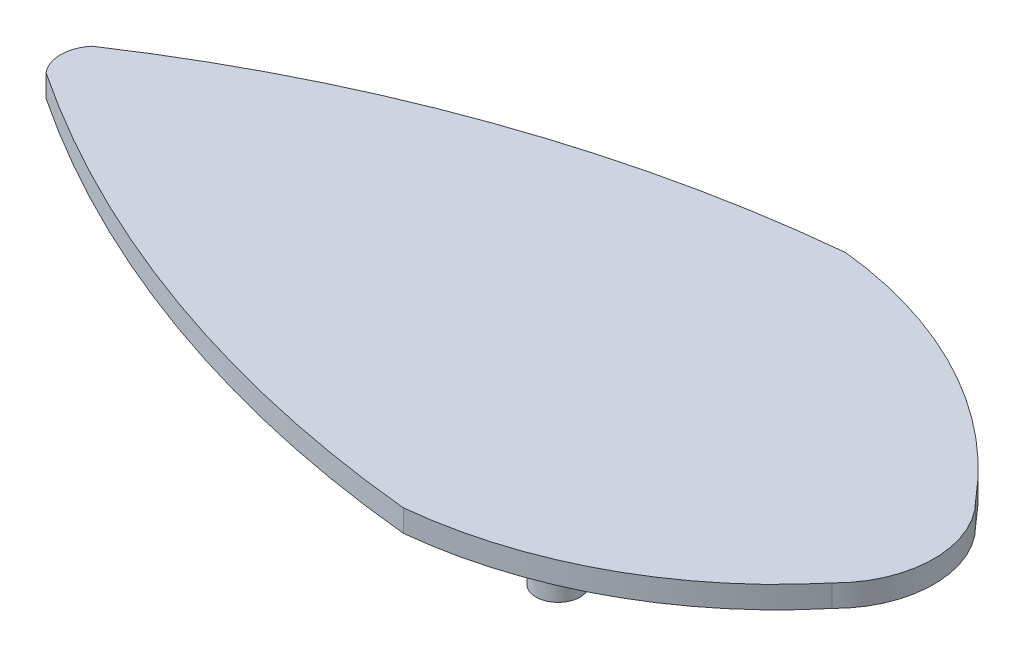
ISO-10303-21;
HEADER;
FILE_DESCRIPTION(('STEP AP214'),'2;1');
FILE_NAME('part.step','',(''),(''),'','','');
FILE_SCHEMA(('AUTOMOTIVE_DESIGN { 1 0 10303 214 1 1 1 1 }'));
ENDSEC;
DATA;
#1=APPLICATION_CONTEXT('core data for automotive mechanical design processes');
#2=APPLICATION_PROTOCOL_DEFINITION('international standard','automotive_design',2000,#1);
#3=PRODUCT_CONTEXT('',#1,'mechanical');
#4=PRODUCT('Part','Part','',(#3));
#5=PRODUCT_RELATED_PRODUCT_CATEGORY('part','',(#4));
#6=PRODUCT_DEFINITION_FORMATION('','',#4);
#7=PRODUCT_DEFINITION_CONTEXT('part definition',#1,'design');
#8=PRODUCT_DEFINITION('design','',#6,#7);
#9=PRODUCT_DEFINITION_SHAPE('','',#8);
#10=(LENGTH_UNIT() NAMED_UNIT(*) SI_UNIT(.MILLI.,.METRE.));
#11=(NAMED_UNIT(*) PLANE_ANGLE_UNIT() SI_UNIT($,.RADIAN.));
#12=(NAMED_UNIT(*) SI_UNIT($,.STERADIAN.) SOLID_ANGLE_UNIT());
#13=UNCERTAINTY_MEASURE_WITH_UNIT(LENGTH_MEASURE(1.E-05),#10,'distance_accuracy_value','');
#14=(GEOMETRIC_REPRESENTATION_CONTEXT(3) GLOBAL_UNCERTAINTY_ASSIGNED_CONTEXT((#13)) GLOBAL_UNIT_ASSIGNED_CONTEXT((#10,
#11,#12)) REPRESENTATION_CONTEXT('',''));
#15=CARTESIAN_POINT('',(0.,0.,0.));
#16=DIRECTION('',(0.,0.,1.));
#17=DIRECTION('',(1.,0.,0.));
#18=AXIS2_PLACEMENT_3D('',#15,#16,#17);
#19=CARTESIAN_POINT('',(-12.4327302607513,6.35,-56.3469062361884));
#20=DIRECTION('',(0.,-1.,0.));
#21=DIRECTION('',(0.,0.,-1.));
#22=AXIS2_PLACEMENT_3D('',#19,#20,#21);
#23=CYLINDRICAL_SURFACE('',#22,120.490056503109);
#24=CARTESIAN_POINT('',(-12.4327302607513,0.,-56.3469062361884));
#25=DIRECTION('',(0.,1.,0.));
#26=DIRECTION('',(0.,0.,1.));
#27=AXIS2_PLACEMENT_3D('',#24,#25,#26);
#28=CIRCLE('',#27,120.490056503109);
#29=CARTESIAN_POINT('',(0.,0.,63.5));
#30=VERTEX_POINT('',#29);
#31=CARTESIAN_POINT('',(80.2701382509386,0.,20.6208265212903));
#32=VERTEX_POINT('',#31);
#33=EDGE_CURVE('E118',#30,#32,#28,.T.);
#34=ORIENTED_EDGE('',*,*,#33,.T.);
#35=DIRECTION('',(0.,-1.,0.));
#36=VECTOR('',#35,1.);
#37=CARTESIAN_POINT('',(80.2701382509386,6.35,20.6208265212903));
#38=LINE('',#37,#36);
#39=CARTESIAN_POINT('',(80.2701382509386,6.35,20.6208265212903));
#40=VERTEX_POINT('',#39);
#41=EDGE_CURVE('E11',#40,#32,#38,.T.);
#42=ORIENTED_EDGE('',*,*,#41,.F.);
#43=CARTESIAN_POINT('',(-12.4327302607513,6.35,-56.3469062361884));
#44=DIRECTION('',(0.,1.,0.));
#45=DIRECTION('',(0.,0.,1.));
#46=AXIS2_PLACEMENT_3D('',#43,#44,#45);
#47=CIRCLE('',#46,120.490056503109);
#48=CARTESIAN_POINT('',(0.,6.35,63.5));
#49=VERTEX_POINT('',#48);
#50=EDGE_CURVE('E129',#49,#40,#47,.T.);
#51=ORIENTED_EDGE('',*,*,#50,.F.);
#52=DIRECTION('',(0.,-1.,0.));
#53=VECTOR('',#52,1.);
#54=CARTESIAN_POINT('',(0.,6.35,63.5));
#55=LINE('',#54,#53);
#56=EDGE_CURVE('E114',#49,#30,#55,.T.);
#57=ORIENTED_EDGE('',*,*,#56,.T.);
#58=EDGE_LOOP('',(#34,#42,#51,#57));
#59=FACE_BOUND('',#58,.T.);
#60=ADVANCED_FACE('F34',(#59),#23,.T.);
#61=CARTESIAN_POINT('',(59.9486091921802,6.35,0.));
#62=DIRECTION('',(0.,-1.,0.));
#63=DIRECTION('',(0.,0.,-1.));
#64=AXIS2_PLACEMENT_3D('',#61,#62,#63);
#65=CYLINDRICAL_SURFACE('',#64,28.9513908078198);
#66=CARTESIAN_POINT('',(59.9486091921802,0.,0.));
#67=DIRECTION('',(0.,1.,0.));
#68=DIRECTION('',(0.,0.,-1.));
#69=AXIS2_PLACEMENT_3D('',#66,#67,#68);
#70=CIRCLE('',#69,28.9513908078198);
#71=CARTESIAN_POINT('',(80.2701382509386,0.,-20.6208265212903));
#72=VERTEX_POINT('',#71);
#73=EDGE_CURVE('E121',#32,#72,#70,.T.);
#74=ORIENTED_EDGE('',*,*,#73,.T.);
#75=DIRECTION('',(0.,-1.,0.));
#76=VECTOR('',#75,1.);
#77=CARTESIAN_POINT('',(80.2701382509386,6.35,-20.6208265212903));
#78=LINE('',#77,#76);
#79=CARTESIAN_POINT('',(80.2701382509386,6.35,-20.6208265212903));
#80=VERTEX_POINT('',#79);
#81=EDGE_CURVE('E42',#80,#72,#78,.T.);
#82=ORIENTED_EDGE('',*,*,#81,.F.);
#83=CARTESIAN_POINT('',(59.9486091921802,6.35,0.));
#84=DIRECTION('',(0.,1.,0.));
#85=DIRECTION('',(0.,0.,-1.));
#86=AXIS2_PLACEMENT_3D('',#83,#84,#85);
#87=CIRCLE('',#86,28.9513908078198);
#88=EDGE_CURVE('E87',#40,#80,#87,.T.);
#89=ORIENTED_EDGE('',*,*,#88,.F.);
#90=ORIENTED_EDGE('',*,*,#41,.T.);
#91=EDGE_LOOP('',(#74,#82,#89,#90));
#92=FACE_BOUND('',#91,.T.);
#93=ADVANCED_FACE('F153',(#92),#65,.T.);
#94=CARTESIAN_POINT('',(-12.4327302607513,6.35,56.3469062361884));
#95=DIRECTION('',(0.,-1.,0.));
#96=DIRECTION('',(0.,0.,-1.));
#97=AXIS2_PLACEMENT_3D('',#94,#95,#96);
#98=CYLINDRICAL_SURFACE('',#97,120.490056503109);
#99=CARTESIAN_POINT('',(-12.4327302607513,0.,56.3469062361884));
#100=DIRECTION('',(0.,1.,0.));
#101=DIRECTION('',(0.,0.,-1.));
#102=AXIS2_PLACEMENT_3D('',#99,#100,#101);
#103=CIRCLE('',#102,120.490056503109);
#104=CARTESIAN_POINT('',(0.,0.,-63.4999999999999));
#105=VERTEX_POINT('',#104);
#106=EDGE_CURVE('E124',#72,#105,#103,.T.);
#107=ORIENTED_EDGE('',*,*,#106,.T.);
#108=DIRECTION('',(0.,-1.,0.));
#109=VECTOR('',#108,1.);
#110=CARTESIAN_POINT('',(0.,6.35,-63.4999999999999));
#111=LINE('',#110,#109);
#112=CARTESIAN_POINT('',(0.,6.35,-63.4999999999999));
#113=VERTEX_POINT('',#112);
#114=EDGE_CURVE('E109',#113,#105,#111,.T.);
#115=ORIENTED_EDGE('',*,*,#114,.F.);
#116=CARTESIAN_POINT('',(-12.4327302607513,6.35,56.3469062361884));
#117=DIRECTION('',(0.,1.,0.));
#118=DIRECTION('',(0.,0.,-1.));
#119=AXIS2_PLACEMENT_3D('',#116,#117,#118);
#120=CIRCLE('',#119,120.490056503109);
#121=EDGE_CURVE('E100',#80,#113,#120,.T.);
#122=ORIENTED_EDGE('',*,*,#121,.F.);
#123=ORIENTED_EDGE('',*,*,#81,.T.);
#124=EDGE_LOOP('',(#107,#115,#122,#123));
#125=FACE_BOUND('',#124,.T.);
#126=ADVANCED_FACE('F135',(#125),#98,.T.);
#127=CARTESIAN_POINT('',(34.1453229325715,6.35,284.349191046045));
#128=DIRECTION('',(0.,-1.,0.));
#129=DIRECTION('',(0.,0.,-1.));
#130=AXIS2_PLACEMENT_3D('',#127,#128,#129);
#131=CYLINDRICAL_SURFACE('',#130,349.521047706082);
#132=CARTESIAN_POINT('',(34.1453229325715,0.,284.349191046045));
#133=DIRECTION('',(0.,1.,0.));
#134=DIRECTION('',(0.,0.,-1.));
#135=AXIS2_PLACEMENT_3D('',#132,#133,#134);
#136=CIRCLE('',#135,349.521047706082);
#137=CARTESIAN_POINT('',(-159.524805442001,0.,-6.60930112239821));
#138=VERTEX_POINT('',#137);
#139=EDGE_CURVE('E108',#105,#138,#136,.T.);
#140=ORIENTED_EDGE('',*,*,#139,.T.);
#141=DIRECTION('',(0.,-1.,0.));
#142=VECTOR('',#141,1.);
#143=CARTESIAN_POINT('',(-159.524805442001,6.35,-6.60930112239821));
#144=LINE('',#143,#142);
#145=CARTESIAN_POINT('',(-159.524805442001,6.35,-6.60930112239821));
#146=VERTEX_POINT('',#145);
#147=EDGE_CURVE('E105',#146,#138,#144,.T.);
#148=ORIENTED_EDGE('',*,*,#147,.F.);
#149=CARTESIAN_POINT('',(34.1453229325715,6.35,284.349191046045));
#150=DIRECTION('',(0.,1.,0.));
#151=DIRECTION('',(0.,0.,-1.));
#152=AXIS2_PLACEMENT_3D('',#149,#150,#151);
#153=CIRCLE('',#152,349.521047706082);
#154=EDGE_CURVE('E94',#113,#146,#153,.T.);
#155=ORIENTED_EDGE('',*,*,#154,.F.);
#156=ORIENTED_EDGE('',*,*,#114,.T.);
#157=EDGE_LOOP('',(#140,#148,#155,#156));
#158=FACE_BOUND('',#157,.T.);
#159=ADVANCED_FACE('F106',(#158),#131,.T.);
#160=CARTESIAN_POINT('',(-151.625044298908,6.35,0.));
#161=DIRECTION('',(0.,-1.,0.));
#162=DIRECTION('',(0.,0.,-1.));
#163=AXIS2_PLACEMENT_3D('',#160,#161,#162);
#164=CYLINDRICAL_SURFACE('',#163,10.299955701092);
#165=CARTESIAN_POINT('',(-151.625044298908,0.,0.));
#166=DIRECTION('',(0.,1.,0.));
#167=DIRECTION('',(0.,0.,1.));
#168=AXIS2_PLACEMENT_3D('',#165,#166,#167);
#169=CIRCLE('',#168,10.299955701092);
#170=CARTESIAN_POINT('',(-159.524805442001,0.,6.60930112239821));
#171=VERTEX_POINT('',#170);
#172=EDGE_CURVE('E73',#138,#171,#169,.T.);
#173=ORIENTED_EDGE('',*,*,#172,.T.);
#174=DIRECTION('',(0.,-1.,0.));
#175=VECTOR('',#174,1.);
#176=CARTESIAN_POINT('',(-159.524805442001,6.35,6.60930112239821));
#177=LINE('',#176,#175);
#178=CARTESIAN_POINT('',(-159.524805442001,6.35,6.60930112239821));
#179=VERTEX_POINT('',#178);
#180=EDGE_CURVE('E110',#179,#171,#177,.T.);
#181=ORIENTED_EDGE('',*,*,#180,.F.);
#182=CARTESIAN_POINT('',(-151.625044298908,6.35,0.));
#183=DIRECTION('',(0.,1.,0.));
#184=DIRECTION('',(0.,0.,1.));
#185=AXIS2_PLACEMENT_3D('',#182,#183,#184);
#186=CIRCLE('',#185,10.299955701092);
#187=EDGE_CURVE('E98',#146,#179,#186,.T.);
#188=ORIENTED_EDGE('',*,*,#187,.F.);
#189=ORIENTED_EDGE('',*,*,#147,.T.);
#190=EDGE_LOOP('',(#173,#181,#188,#189));
#191=FACE_BOUND('',#190,.T.);
#192=ADVANCED_FACE('F112',(#191),#164,.T.);
#193=CARTESIAN_POINT('',(34.1453229325715,6.35,-284.349191046045));
#194=DIRECTION('',(0.,-1.,0.));
#195=DIRECTION('',(0.,0.,-1.));
#196=AXIS2_PLACEMENT_3D('',#193,#194,#195);
#197=CYLINDRICAL_SURFACE('',#196,349.521047706082);
#198=CARTESIAN_POINT('',(34.1453229325715,0.,-284.349191046045));
#199=DIRECTION('',(0.,1.,0.));
#200=DIRECTION('',(0.,0.,1.));
#201=AXIS2_PLACEMENT_3D('',#198,#199,#200);
#202=CIRCLE('',#201,349.521047706082);
#203=EDGE_CURVE('E79',#171,#30,#202,.T.);
#204=ORIENTED_EDGE('',*,*,#203,.T.);
#205=ORIENTED_EDGE('',*,*,#56,.F.);
#206=CARTESIAN_POINT('',(34.1453229325715,6.35,-284.349191046045));
#207=DIRECTION('',(0.,1.,0.));
#208=DIRECTION('',(0.,0.,1.));
#209=AXIS2_PLACEMENT_3D('',#206,#207,#208);
#210=CIRCLE('',#209,349.521047706082);
#211=EDGE_CURVE('E50',#179,#49,#210,.T.);
#212=ORIENTED_EDGE('',*,*,#211,.F.);
#213=ORIENTED_EDGE('',*,*,#180,.T.);
#214=EDGE_LOOP('',(#204,#205,#212,#213));
#215=FACE_BOUND('',#214,.T.);
#216=ADVANCED_FACE('F142',(#215),#197,.T.);
#217=CARTESIAN_POINT('',(23.7579394657144,6.35,-28.1734531180942));
#218=DIRECTION('',(0.,1.,0.));
#219=DIRECTION('',(0.,0.,1.));
#220=AXIS2_PLACEMENT_3D('',#217,#218,#219);
#221=PLANE('',#220);
#222=ORIENTED_EDGE('',*,*,#50,.T.);
#223=ORIENTED_EDGE('',*,*,#88,.T.);
#224=ORIENTED_EDGE('',*,*,#121,.T.);
#225=ORIENTED_EDGE('',*,*,#154,.T.);
#226=ORIENTED_EDGE('',*,*,#187,.T.);
#227=ORIENTED_EDGE('',*,*,#211,.T.);
#228=EDGE_LOOP('',(#222,#223,#224,#225,#226,#227));
#229=FACE_BOUND('',#228,.T.);
#230=ADVANCED_FACE('F96',(#229),#221,.T.);
#231=CARTESIAN_POINT('',(23.7579394657144,0.,-28.1734531180942));
#232=DIRECTION('',(0.,1.,0.));
#233=DIRECTION('',(0.,0.,1.));
#234=AXIS2_PLACEMENT_3D('',#231,#232,#233);
#235=PLANE('',#234);
#236=CARTESIAN_POINT('',(-136.525,0.,0.));
#237=DIRECTION('',(0.,1.,0.));
#238=DIRECTION('',(0.,0.,1.));
#239=AXIS2_PLACEMENT_3D('',#236,#237,#238);
#240=CIRCLE('',#239,6.35);
#241=CARTESIAN_POINT('',(-136.525,0.,6.34999999999999));
#242=VERTEX_POINT('',#241);
#243=EDGE_CURVE('E257',#242,#242,#240,.T.);
#244=ORIENTED_EDGE('',*,*,#243,.T.);
#245=EDGE_LOOP('',(#244));
#246=FACE_BOUND('',#245,.T.);
#247=CARTESIAN_POINT('',(28.575,0.,47.625));
#248=DIRECTION('',(0.,1.,0.));
#249=DIRECTION('',(0.,0.,1.));
#250=AXIS2_PLACEMENT_3D('',#247,#248,#249);
#251=CIRCLE('',#250,6.35);
#252=CARTESIAN_POINT('',(28.575,0.,53.975));
#253=VERTEX_POINT('',#252);
#254=EDGE_CURVE('E256',#253,#253,#251,.T.);
#255=ORIENTED_EDGE('',*,*,#254,.T.);
#256=EDGE_LOOP('',(#255));
#257=FACE_BOUND('',#256,.T.);
#258=CARTESIAN_POINT('',(28.575,0.,-47.625));
#259=DIRECTION('',(0.,1.,0.));
#260=DIRECTION('',(0.,0.,1.));
#261=AXIS2_PLACEMENT_3D('',#258,#259,#260);
#262=CIRCLE('',#261,6.35);
#263=CARTESIAN_POINT('',(28.575,0.,-41.275));
#264=VERTEX_POINT('',#263);
#265=EDGE_CURVE('E266',#264,#264,#262,.T.);
#266=ORIENTED_EDGE('',*,*,#265,.T.);
#267=EDGE_LOOP('',(#266));
#268=FACE_BOUND('',#267,.T.);
#269=ORIENTED_EDGE('',*,*,#33,.F.);
#270=ORIENTED_EDGE('',*,*,#203,.F.);
#271=ORIENTED_EDGE('',*,*,#172,.F.);
#272=ORIENTED_EDGE('',*,*,#139,.F.);
#273=ORIENTED_EDGE('',*,*,#106,.F.);
#274=ORIENTED_EDGE('',*,*,#73,.F.);
#275=EDGE_LOOP('',(#269,#270,#271,#272,#273,#274));
#276=FACE_BOUND('',#275,.T.);
#277=ADVANCED_FACE('F138',(#246,#257,#268,#276),#235,.F.);
#278=CARTESIAN_POINT('',(28.575,-6.35,-47.625));
#279=DIRECTION('',(0.,1.,0.));
#280=DIRECTION('',(0.,0.,1.));
#281=AXIS2_PLACEMENT_3D('',#278,#279,#280);
#282=CYLINDRICAL_SURFACE('',#281,6.35);
#283=CARTESIAN_POINT('',(28.575,-6.35,-47.625));
#284=DIRECTION('',(0.,1.,0.));
#285=DIRECTION('',(0.,0.,1.));
#286=AXIS2_PLACEMENT_3D('',#283,#284,#285);
#287=CIRCLE('',#286,6.35);
#288=CARTESIAN_POINT('',(28.575,-6.35,-41.275));
#289=VERTEX_POINT('',#288);
#290=EDGE_CURVE('E122',#289,#289,#287,.T.);
#291=ORIENTED_EDGE('',*,*,#290,.T.);
#292=EDGE_LOOP('',(#291));
#293=FACE_BOUND('',#292,.T.);
#294=ORIENTED_EDGE('',*,*,#265,.F.);
#295=EDGE_LOOP('',(#294));
#296=FACE_BOUND('',#295,.T.);
#297=ADVANCED_FACE('F190',(#293,#296),#282,.T.);
#298=CARTESIAN_POINT('',(28.575,-6.35,-47.625));
#299=DIRECTION('',(0.,1.,0.));
#300=DIRECTION('',(0.,0.,1.));
#301=AXIS2_PLACEMENT_3D('',#298,#299,#300);
#302=PLANE('',#301);
#303=ORIENTED_EDGE('',*,*,#290,.F.);
#304=EDGE_LOOP('',(#303));
#305=FACE_BOUND('',#304,.T.);
#306=ADVANCED_FACE('F199',(#305),#302,.F.);
#307=CARTESIAN_POINT('',(28.575,-6.35,47.625));
#308=DIRECTION('',(0.,1.,0.));
#309=DIRECTION('',(0.,0.,1.));
#310=AXIS2_PLACEMENT_3D('',#307,#308,#309);
#311=CYLINDRICAL_SURFACE('',#310,6.35);
#312=CARTESIAN_POINT('',(28.575,-6.35,47.625));
#313=DIRECTION('',(0.,1.,0.));
#314=DIRECTION('',(0.,0.,1.));
#315=AXIS2_PLACEMENT_3D('',#312,#313,#314);
#316=CIRCLE('',#315,6.35);
#317=CARTESIAN_POINT('',(28.575,-6.35,53.975));
#318=VERTEX_POINT('',#317);
#319=EDGE_CURVE('E260',#318,#318,#316,.T.);
#320=ORIENTED_EDGE('',*,*,#319,.T.);
#321=EDGE_LOOP('',(#320));
#322=FACE_BOUND('',#321,.T.);
#323=ORIENTED_EDGE('',*,*,#254,.F.);
#324=EDGE_LOOP('',(#323));
#325=FACE_BOUND('',#324,.T.);
#326=ADVANCED_FACE('F209',(#322,#325),#311,.T.);
#327=CARTESIAN_POINT('',(28.575,-6.35,47.625));
#328=DIRECTION('',(0.,1.,0.));
#329=DIRECTION('',(0.,0.,1.));
#330=AXIS2_PLACEMENT_3D('',#327,#328,#329);
#331=PLANE('',#330);
#332=ORIENTED_EDGE('',*,*,#319,.F.);
#333=EDGE_LOOP('',(#332));
#334=FACE_BOUND('',#333,.T.);
#335=ADVANCED_FACE('F219',(#334),#331,.F.);
#336=CARTESIAN_POINT('',(-136.525,-6.35,0.));
#337=DIRECTION('',(0.,1.,0.));
#338=DIRECTION('',(0.,0.,1.));
#339=AXIS2_PLACEMENT_3D('',#336,#337,#338);
#340=CYLINDRICAL_SURFACE('',#339,6.35);
#341=CARTESIAN_POINT('',(-136.525,-6.35,0.));
#342=DIRECTION('',(0.,1.,0.));
#343=DIRECTION('',(0.,0.,1.));
#344=AXIS2_PLACEMENT_3D('',#341,#342,#343);
#345=CIRCLE('',#344,6.35);
#346=CARTESIAN_POINT('',(-136.525,-6.35,6.34999999999999));
#347=VERTEX_POINT('',#346);
#348=EDGE_CURVE('E255',#347,#347,#345,.T.);
#349=ORIENTED_EDGE('',*,*,#348,.T.);
#350=EDGE_LOOP('',(#349));
#351=FACE_BOUND('',#350,.T.);
#352=ORIENTED_EDGE('',*,*,#243,.F.);
#353=EDGE_LOOP('',(#352));
#354=FACE_BOUND('',#353,.T.);
#355=ADVANCED_FACE('F229',(#351,#354),#340,.T.);
#356=CARTESIAN_POINT('',(-136.525,-6.35,0.));
#357=DIRECTION('',(0.,1.,0.));
#358=DIRECTION('',(0.,0.,1.));
#359=AXIS2_PLACEMENT_3D('',#356,#357,#358);
#360=PLANE('',#359);
#361=ORIENTED_EDGE('',*,*,#348,.F.);
#362=EDGE_LOOP('',(#361));
#363=FACE_BOUND('',#362,.T.);
#364=ADVANCED_FACE('F239',(#363),#360,.F.);
#365=CLOSED_SHELL('',(#60,#93,#126,#159,#192,#216,#230,#277,#297,#306,#326,#335,#355,#364));
#366=MANIFOLD_SOLID_BREP('B2',#365);
#367=ADVANCED_BREP_SHAPE_REPRESENTATION('',(#18,#366),#14);
#368=SHAPE_DEFINITION_REPRESENTATION(#9,#367);
ENDSEC;
END-ISO-10303-21;
